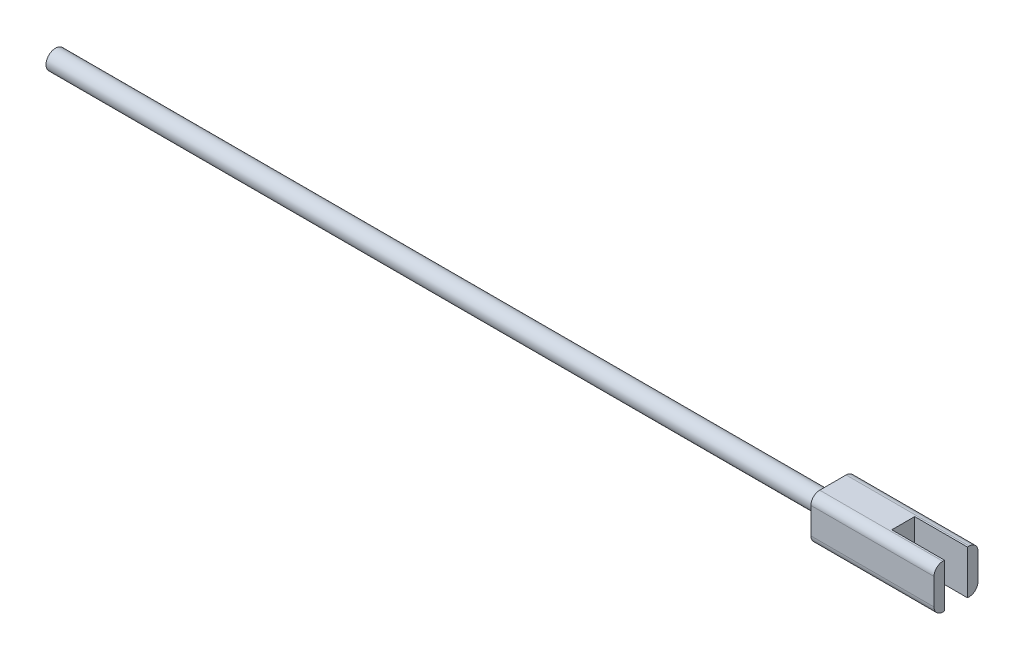
ISO-10303-21;
HEADER;
FILE_DESCRIPTION(('STEP AP214'),'2;1');
FILE_NAME('part.step','',(''),(''),'','','');
FILE_SCHEMA(('AUTOMOTIVE_DESIGN { 1 0 10303 214 1 1 1 1 }'));
ENDSEC;
DATA;
#1=APPLICATION_CONTEXT('core data for automotive mechanical design processes');
#2=APPLICATION_PROTOCOL_DEFINITION('international standard','automotive_design',2000,#1);
#3=PRODUCT_CONTEXT('',#1,'mechanical');
#4=PRODUCT('Part','Part','',(#3));
#5=PRODUCT_RELATED_PRODUCT_CATEGORY('part','',(#4));
#6=PRODUCT_DEFINITION_FORMATION('','',#4);
#7=PRODUCT_DEFINITION_CONTEXT('part definition',#1,'design');
#8=PRODUCT_DEFINITION('design','',#6,#7);
#9=PRODUCT_DEFINITION_SHAPE('','',#8);
#10=(LENGTH_UNIT() NAMED_UNIT(*) SI_UNIT(.MILLI.,.METRE.));
#11=(NAMED_UNIT(*) PLANE_ANGLE_UNIT() SI_UNIT($,.RADIAN.));
#12=(NAMED_UNIT(*) SI_UNIT($,.STERADIAN.) SOLID_ANGLE_UNIT());
#13=UNCERTAINTY_MEASURE_WITH_UNIT(LENGTH_MEASURE(1.E-05),#10,'distance_accuracy_value','');
#14=(GEOMETRIC_REPRESENTATION_CONTEXT(3) GLOBAL_UNCERTAINTY_ASSIGNED_CONTEXT((#13)) GLOBAL_UNIT_ASSIGNED_CONTEXT((#10,
#11,#12)) REPRESENTATION_CONTEXT('',''));
#15=CARTESIAN_POINT('',(0.,0.,0.));
#16=DIRECTION('',(0.,0.,1.));
#17=DIRECTION('',(1.,0.,0.));
#18=AXIS2_PLACEMENT_3D('',#15,#16,#17);
#19=CARTESIAN_POINT('',(102.392,-1.5,1.5));
#20=DIRECTION('',(1.,0.,0.));
#21=DIRECTION('',(0.,0.,-1.));
#22=AXIS2_PLACEMENT_3D('',#19,#20,#21);
#23=PLANE('',#22);
#24=DIRECTION('',(0.,1.,0.));
#25=VECTOR('',#24,1.);
#26=CARTESIAN_POINT('',(102.392,-1.5,-1.3));
#27=LINE('',#26,#25);
#28=CARTESIAN_POINT('',(102.392,-2.5,-1.3));
#29=VERTEX_POINT('',#28);
#30=CARTESIAN_POINT('',(102.392,2.5,-1.3));
#31=VERTEX_POINT('',#30);
#32=EDGE_CURVE('E11',#29,#31,#27,.T.);
#33=ORIENTED_EDGE('',*,*,#32,.F.);
#34=DIRECTION('',(0.,0.,-1.));
#35=VECTOR('',#34,1.);
#36=CARTESIAN_POINT('',(102.392,-2.5,1.5));
#37=LINE('',#36,#35);
#38=CARTESIAN_POINT('',(102.392,-2.5,-1.5));
#39=VERTEX_POINT('',#38);
#40=EDGE_CURVE('E202',#29,#39,#37,.T.);
#41=ORIENTED_EDGE('',*,*,#40,.T.);
#42=CARTESIAN_POINT('',(102.392,-1.5,-1.5));
#43=DIRECTION('',(1.,0.,0.));
#44=DIRECTION('',(0.,0.,-1.));
#45=AXIS2_PLACEMENT_3D('',#42,#43,#44);
#46=CIRCLE('',#45,1.);
#47=CARTESIAN_POINT('',(102.392,-1.5,-2.5));
#48=VERTEX_POINT('',#47);
#49=EDGE_CURVE('E201',#39,#48,#46,.T.);
#50=ORIENTED_EDGE('',*,*,#49,.T.);
#51=DIRECTION('',(0.,1.,0.));
#52=VECTOR('',#51,1.);
#53=CARTESIAN_POINT('',(102.392,-1.5,-2.5));
#54=LINE('',#53,#52);
#55=CARTESIAN_POINT('',(102.392,1.5,-2.5));
#56=VERTEX_POINT('',#55);
#57=EDGE_CURVE('E204',#48,#56,#54,.T.);
#58=ORIENTED_EDGE('',*,*,#57,.T.);
#59=CARTESIAN_POINT('',(102.392,1.5,-1.5));
#60=DIRECTION('',(1.,0.,0.));
#61=DIRECTION('',(0.,0.,-1.));
#62=AXIS2_PLACEMENT_3D('',#59,#60,#61);
#63=CIRCLE('',#62,1.);
#64=CARTESIAN_POINT('',(102.392,2.5,-1.5));
#65=VERTEX_POINT('',#64);
#66=EDGE_CURVE('E129',#56,#65,#63,.T.);
#67=ORIENTED_EDGE('',*,*,#66,.T.);
#68=DIRECTION('',(0.,0.,1.));
#69=VECTOR('',#68,1.);
#70=CARTESIAN_POINT('',(102.392,2.5,-1.5));
#71=LINE('',#70,#69);
#72=EDGE_CURVE('E128',#65,#31,#71,.T.);
#73=ORIENTED_EDGE('',*,*,#72,.T.);
#74=EDGE_LOOP('',(#33,#41,#50,#58,#67,#73));
#75=FACE_BOUND('',#74,.T.);
#76=ADVANCED_FACE('F39',(#75),#23,.T.);
#77=CARTESIAN_POINT('',(90.392,0.,0.));
#78=DIRECTION('',(-1.,0.,0.));
#79=DIRECTION('',(0.,0.,1.));
#80=AXIS2_PLACEMENT_3D('',#77,#78,#79);
#81=CYLINDRICAL_SURFACE('',#80,1.09);
#82=CARTESIAN_POINT('',(0.,0.,0.));
#83=DIRECTION('',(1.,0.,0.));
#84=DIRECTION('',(0.,0.,-1.));
#85=AXIS2_PLACEMENT_3D('',#82,#83,#84);
#86=CIRCLE('',#85,1.09);
#87=CARTESIAN_POINT('',(0.,0.,-1.09));
#88=VERTEX_POINT('',#87);
#89=EDGE_CURVE('E181',#88,#88,#86,.T.);
#90=ORIENTED_EDGE('',*,*,#89,.T.);
#91=EDGE_LOOP('',(#90));
#92=FACE_BOUND('',#91,.T.);
#93=CARTESIAN_POINT('',(88.392,0.,0.));
#94=DIRECTION('',(1.,0.,0.));
#95=DIRECTION('',(0.,0.,-1.));
#96=AXIS2_PLACEMENT_3D('',#93,#94,#95);
#97=CIRCLE('',#96,1.09);
#98=CARTESIAN_POINT('',(88.392,0.,-1.09));
#99=VERTEX_POINT('',#98);
#100=EDGE_CURVE('E184',#99,#99,#97,.T.);
#101=ORIENTED_EDGE('',*,*,#100,.F.);
#102=EDGE_LOOP('',(#101));
#103=FACE_BOUND('',#102,.T.);
#104=ADVANCED_FACE('F41',(#92,#103),#81,.T.);
#105=CARTESIAN_POINT('',(0.,0.,0.));
#106=DIRECTION('',(1.,0.,0.));
#107=DIRECTION('',(0.,0.,-1.));
#108=AXIS2_PLACEMENT_3D('',#105,#106,#107);
#109=PLANE('',#108);
#110=ORIENTED_EDGE('',*,*,#89,.F.);
#111=EDGE_LOOP('',(#110));
#112=FACE_BOUND('',#111,.T.);
#113=ADVANCED_FACE('F264',(#112),#109,.F.);
#114=CARTESIAN_POINT('',(102.392,-1.5,1.5));
#115=DIRECTION('',(-1.,0.,0.));
#116=DIRECTION('',(0.,0.,1.));
#117=AXIS2_PLACEMENT_3D('',#114,#115,#116);
#118=CYLINDRICAL_SURFACE('',#117,1.);
#119=CARTESIAN_POINT('',(88.392,-1.5,1.5));
#120=DIRECTION('',(1.,0.,0.));
#121=DIRECTION('',(0.,0.,-1.));
#122=AXIS2_PLACEMENT_3D('',#119,#120,#121);
#123=CIRCLE('',#122,1.);
#124=CARTESIAN_POINT('',(88.392,-1.5,2.5));
#125=VERTEX_POINT('',#124);
#126=CARTESIAN_POINT('',(88.392,-2.5,1.5));
#127=VERTEX_POINT('',#126);
#128=EDGE_CURVE('E150',#125,#127,#123,.T.);
#129=ORIENTED_EDGE('',*,*,#128,.T.);
#130=DIRECTION('',(-1.,0.,0.));
#131=VECTOR('',#130,1.);
#132=CARTESIAN_POINT('',(102.392,-2.5,1.5));
#133=LINE('',#132,#131);
#134=CARTESIAN_POINT('',(102.392,-2.5,1.5));
#135=VERTEX_POINT('',#134);
#136=EDGE_CURVE('E179',#135,#127,#133,.T.);
#137=ORIENTED_EDGE('',*,*,#136,.F.);
#138=CARTESIAN_POINT('',(102.392,-1.5,1.5));
#139=DIRECTION('',(1.,0.,0.));
#140=DIRECTION('',(0.,0.,-1.));
#141=AXIS2_PLACEMENT_3D('',#138,#139,#140);
#142=CIRCLE('',#141,1.);
#143=CARTESIAN_POINT('',(102.392,-1.5,2.5));
#144=VERTEX_POINT('',#143);
#145=EDGE_CURVE('E166',#144,#135,#142,.T.);
#146=ORIENTED_EDGE('',*,*,#145,.F.);
#147=DIRECTION('',(-1.,0.,0.));
#148=VECTOR('',#147,1.);
#149=CARTESIAN_POINT('',(102.392,-1.5,2.5));
#150=LINE('',#149,#148);
#151=EDGE_CURVE('E145',#144,#125,#150,.T.);
#152=ORIENTED_EDGE('',*,*,#151,.T.);
#153=EDGE_LOOP('',(#129,#137,#146,#152));
#154=FACE_BOUND('',#153,.T.);
#155=ADVANCED_FACE('F262',(#154),#118,.T.);
#156=CARTESIAN_POINT('',(102.392,-2.5,1.5));
#157=DIRECTION('',(0.,1.,0.));
#158=DIRECTION('',(0.,0.,1.));
#159=AXIS2_PLACEMENT_3D('',#156,#157,#158);
#160=PLANE('',#159);
#161=ORIENTED_EDGE('',*,*,#40,.F.);
#162=DIRECTION('',(-1.,0.,0.));
#163=VECTOR('',#162,1.);
#164=CARTESIAN_POINT('',(96.392,-2.5,-1.3));
#165=LINE('',#164,#163);
#166=CARTESIAN_POINT('',(96.392,-2.5,-1.3));
#167=VERTEX_POINT('',#166);
#168=EDGE_CURVE('E197',#29,#167,#165,.T.);
#169=ORIENTED_EDGE('',*,*,#168,.T.);
#170=DIRECTION('',(0.,0.,1.));
#171=VECTOR('',#170,1.);
#172=CARTESIAN_POINT('',(96.392,-2.5,1.3));
#173=LINE('',#172,#171);
#174=CARTESIAN_POINT('',(96.392,-2.5,1.3));
#175=VERTEX_POINT('',#174);
#176=EDGE_CURVE('E196',#167,#175,#173,.T.);
#177=ORIENTED_EDGE('',*,*,#176,.T.);
#178=DIRECTION('',(1.,0.,0.));
#179=VECTOR('',#178,1.);
#180=CARTESIAN_POINT('',(103.392,-2.5,1.3));
#181=LINE('',#180,#179);
#182=CARTESIAN_POINT('',(102.392,-2.5,1.3));
#183=VERTEX_POINT('',#182);
#184=EDGE_CURVE('E189',#175,#183,#181,.T.);
#185=ORIENTED_EDGE('',*,*,#184,.T.);
#186=EDGE_CURVE('E105',#135,#183,#37,.T.);
#187=ORIENTED_EDGE('',*,*,#186,.F.);
#188=ORIENTED_EDGE('',*,*,#136,.T.);
#189=DIRECTION('',(0.,0.,-1.));
#190=VECTOR('',#189,1.);
#191=CARTESIAN_POINT('',(88.392,-2.5,1.5));
#192=LINE('',#191,#190);
#193=CARTESIAN_POINT('',(88.392,-2.5,-1.5));
#194=VERTEX_POINT('',#193);
#195=EDGE_CURVE('E153',#127,#194,#192,.T.);
#196=ORIENTED_EDGE('',*,*,#195,.T.);
#197=DIRECTION('',(-1.,0.,0.));
#198=VECTOR('',#197,1.);
#199=CARTESIAN_POINT('',(102.392,-2.5,-1.5));
#200=LINE('',#199,#198);
#201=EDGE_CURVE('E176',#39,#194,#200,.T.);
#202=ORIENTED_EDGE('',*,*,#201,.F.);
#203=EDGE_LOOP('',(#161,#169,#177,#185,#187,#188,#196,#202));
#204=FACE_BOUND('',#203,.T.);
#205=ADVANCED_FACE('F193',(#204),#160,.F.);
#206=CARTESIAN_POINT('',(102.392,-1.5,-1.5));
#207=DIRECTION('',(-1.,0.,0.));
#208=DIRECTION('',(0.,0.,1.));
#209=AXIS2_PLACEMENT_3D('',#206,#207,#208);
#210=CYLINDRICAL_SURFACE('',#209,1.);
#211=CARTESIAN_POINT('',(88.392,-1.5,-1.5));
#212=DIRECTION('',(1.,0.,0.));
#213=DIRECTION('',(0.,0.,-1.));
#214=AXIS2_PLACEMENT_3D('',#211,#212,#213);
#215=CIRCLE('',#214,1.);
#216=CARTESIAN_POINT('',(88.392,-1.5,-2.5));
#217=VERTEX_POINT('',#216);
#218=EDGE_CURVE('E156',#194,#217,#215,.T.);
#219=ORIENTED_EDGE('',*,*,#218,.T.);
#220=DIRECTION('',(-1.,0.,0.));
#221=VECTOR('',#220,1.);
#222=CARTESIAN_POINT('',(102.392,-1.5,-2.5));
#223=LINE('',#222,#221);
#224=EDGE_CURVE('E173',#48,#217,#223,.T.);
#225=ORIENTED_EDGE('',*,*,#224,.F.);
#226=ORIENTED_EDGE('',*,*,#49,.F.);
#227=ORIENTED_EDGE('',*,*,#201,.T.);
#228=EDGE_LOOP('',(#219,#225,#226,#227));
#229=FACE_BOUND('',#228,.T.);
#230=ADVANCED_FACE('F253',(#229),#210,.T.);
#231=CARTESIAN_POINT('',(102.392,-1.5,-2.5));
#232=DIRECTION('',(0.,0.,1.));
#233=DIRECTION('',(1.,0.,0.));
#234=AXIS2_PLACEMENT_3D('',#231,#232,#233);
#235=PLANE('',#234);
#236=DIRECTION('',(0.,1.,0.));
#237=VECTOR('',#236,1.);
#238=CARTESIAN_POINT('',(88.392,-1.5,-2.5));
#239=LINE('',#238,#237);
#240=CARTESIAN_POINT('',(88.392,1.5,-2.5));
#241=VERTEX_POINT('',#240);
#242=EDGE_CURVE('E158',#217,#241,#239,.T.);
#243=ORIENTED_EDGE('',*,*,#242,.T.);
#244=DIRECTION('',(-1.,0.,0.));
#245=VECTOR('',#244,1.);
#246=CARTESIAN_POINT('',(102.392,1.5,-2.5));
#247=LINE('',#246,#245);
#248=EDGE_CURVE('E170',#56,#241,#247,.T.);
#249=ORIENTED_EDGE('',*,*,#248,.F.);
#250=ORIENTED_EDGE('',*,*,#57,.F.);
#251=ORIENTED_EDGE('',*,*,#224,.T.);
#252=EDGE_LOOP('',(#243,#249,#250,#251));
#253=FACE_BOUND('',#252,.T.);
#254=ADVANCED_FACE('F256',(#253),#235,.F.);
#255=CARTESIAN_POINT('',(102.392,1.5,-1.5));
#256=DIRECTION('',(-1.,0.,0.));
#257=DIRECTION('',(0.,0.,1.));
#258=AXIS2_PLACEMENT_3D('',#255,#256,#257);
#259=CYLINDRICAL_SURFACE('',#258,1.);
#260=CARTESIAN_POINT('',(88.392,1.5,-1.5));
#261=DIRECTION('',(1.,0.,0.));
#262=DIRECTION('',(0.,0.,-1.));
#263=AXIS2_PLACEMENT_3D('',#260,#261,#262);
#264=CIRCLE('',#263,1.);
#265=CARTESIAN_POINT('',(88.392,2.5,-1.5));
#266=VERTEX_POINT('',#265);
#267=EDGE_CURVE('E160',#241,#266,#264,.T.);
#268=ORIENTED_EDGE('',*,*,#267,.T.);
#269=DIRECTION('',(-1.,0.,0.));
#270=VECTOR('',#269,1.);
#271=CARTESIAN_POINT('',(102.392,2.5,-1.5));
#272=LINE('',#271,#270);
#273=EDGE_CURVE('E140',#65,#266,#272,.T.);
#274=ORIENTED_EDGE('',*,*,#273,.F.);
#275=ORIENTED_EDGE('',*,*,#66,.F.);
#276=ORIENTED_EDGE('',*,*,#248,.T.);
#277=EDGE_LOOP('',(#268,#274,#275,#276));
#278=FACE_BOUND('',#277,.T.);
#279=ADVANCED_FACE('F218',(#278),#259,.T.);
#280=CARTESIAN_POINT('',(102.392,2.5,-1.5));
#281=DIRECTION('',(0.,-1.,0.));
#282=DIRECTION('',(0.,0.,-1.));
#283=AXIS2_PLACEMENT_3D('',#280,#281,#282);
#284=PLANE('',#283);
#285=DIRECTION('',(0.,0.,1.));
#286=VECTOR('',#285,1.);
#287=CARTESIAN_POINT('',(96.392,2.5,1.3));
#288=LINE('',#287,#286);
#289=CARTESIAN_POINT('',(96.392,2.5,-1.3));
#290=VERTEX_POINT('',#289);
#291=CARTESIAN_POINT('',(96.392,2.5,1.3));
#292=VERTEX_POINT('',#291);
#293=EDGE_CURVE('E225',#290,#292,#288,.T.);
#294=ORIENTED_EDGE('',*,*,#293,.F.);
#295=DIRECTION('',(-1.,0.,0.));
#296=VECTOR('',#295,1.);
#297=CARTESIAN_POINT('',(96.392,2.5,-1.3));
#298=LINE('',#297,#296);
#299=EDGE_CURVE('E222',#31,#290,#298,.T.);
#300=ORIENTED_EDGE('',*,*,#299,.F.);
#301=ORIENTED_EDGE('',*,*,#72,.F.);
#302=ORIENTED_EDGE('',*,*,#273,.T.);
#303=DIRECTION('',(0.,0.,1.));
#304=VECTOR('',#303,1.);
#305=CARTESIAN_POINT('',(88.392,2.5,-1.5));
#306=LINE('',#305,#304);
#307=CARTESIAN_POINT('',(88.392,2.5,1.5));
#308=VERTEX_POINT('',#307);
#309=EDGE_CURVE('E137',#266,#308,#306,.T.);
#310=ORIENTED_EDGE('',*,*,#309,.T.);
#311=DIRECTION('',(-1.,0.,0.));
#312=VECTOR('',#311,1.);
#313=CARTESIAN_POINT('',(102.392,2.5,1.5));
#314=LINE('',#313,#312);
#315=CARTESIAN_POINT('',(102.392,2.5,1.5));
#316=VERTEX_POINT('',#315);
#317=EDGE_CURVE('E132',#316,#308,#314,.T.);
#318=ORIENTED_EDGE('',*,*,#317,.F.);
#319=CARTESIAN_POINT('',(102.392,2.5,1.3));
#320=VERTEX_POINT('',#319);
#321=EDGE_CURVE('E121',#320,#316,#71,.T.);
#322=ORIENTED_EDGE('',*,*,#321,.F.);
#323=DIRECTION('',(1.,0.,0.));
#324=VECTOR('',#323,1.);
#325=CARTESIAN_POINT('',(103.392,2.5,1.3));
#326=LINE('',#325,#324);
#327=EDGE_CURVE('E54',#292,#320,#326,.T.);
#328=ORIENTED_EDGE('',*,*,#327,.F.);
#329=EDGE_LOOP('',(#294,#300,#301,#302,#310,#318,#322,#328));
#330=FACE_BOUND('',#329,.T.);
#331=ADVANCED_FACE('F134',(#330),#284,.F.);
#332=CARTESIAN_POINT('',(102.392,1.5,1.5));
#333=DIRECTION('',(-1.,0.,0.));
#334=DIRECTION('',(0.,0.,1.));
#335=AXIS2_PLACEMENT_3D('',#332,#333,#334);
#336=CYLINDRICAL_SURFACE('',#335,1.);
#337=CARTESIAN_POINT('',(88.392,1.5,1.5));
#338=DIRECTION('',(1.,0.,0.));
#339=DIRECTION('',(0.,0.,-1.));
#340=AXIS2_PLACEMENT_3D('',#337,#338,#339);
#341=CIRCLE('',#340,1.);
#342=CARTESIAN_POINT('',(88.392,1.5,2.5));
#343=VERTEX_POINT('',#342);
#344=EDGE_CURVE('E163',#308,#343,#341,.T.);
#345=ORIENTED_EDGE('',*,*,#344,.T.);
#346=DIRECTION('',(-1.,0.,0.));
#347=VECTOR('',#346,1.);
#348=CARTESIAN_POINT('',(102.392,1.5,2.5));
#349=LINE('',#348,#347);
#350=CARTESIAN_POINT('',(102.392,1.5,2.5));
#351=VERTEX_POINT('',#350);
#352=EDGE_CURVE('E141',#351,#343,#349,.T.);
#353=ORIENTED_EDGE('',*,*,#352,.F.);
#354=CARTESIAN_POINT('',(102.392,1.5,1.5));
#355=DIRECTION('',(1.,0.,0.));
#356=DIRECTION('',(0.,0.,-1.));
#357=AXIS2_PLACEMENT_3D('',#354,#355,#356);
#358=CIRCLE('',#357,1.);
#359=EDGE_CURVE('E125',#316,#351,#358,.T.);
#360=ORIENTED_EDGE('',*,*,#359,.F.);
#361=ORIENTED_EDGE('',*,*,#317,.T.);
#362=EDGE_LOOP('',(#345,#353,#360,#361));
#363=FACE_BOUND('',#362,.T.);
#364=ADVANCED_FACE('F143',(#363),#336,.T.);
#365=CARTESIAN_POINT('',(102.392,1.5,2.5));
#366=DIRECTION('',(0.,0.,-1.));
#367=DIRECTION('',(-1.,0.,0.));
#368=AXIS2_PLACEMENT_3D('',#365,#366,#367);
#369=PLANE('',#368);
#370=DIRECTION('',(0.,-1.,0.));
#371=VECTOR('',#370,1.);
#372=CARTESIAN_POINT('',(88.392,1.5,2.5));
#373=LINE('',#372,#371);
#374=EDGE_CURVE('E96',#343,#125,#373,.T.);
#375=ORIENTED_EDGE('',*,*,#374,.T.);
#376=ORIENTED_EDGE('',*,*,#151,.F.);
#377=DIRECTION('',(0.,-1.,0.));
#378=VECTOR('',#377,1.);
#379=CARTESIAN_POINT('',(102.392,1.5,2.5));
#380=LINE('',#379,#378);
#381=EDGE_CURVE('E63',#351,#144,#380,.T.);
#382=ORIENTED_EDGE('',*,*,#381,.F.);
#383=ORIENTED_EDGE('',*,*,#352,.T.);
#384=EDGE_LOOP('',(#375,#376,#382,#383));
#385=FACE_BOUND('',#384,.T.);
#386=ADVANCED_FACE('F260',(#385),#369,.F.);
#387=DIRECTION('',(0.,-1.,0.));
#388=VECTOR('',#387,1.);
#389=CARTESIAN_POINT('',(102.392,-1.5,1.3));
#390=LINE('',#389,#388);
#391=EDGE_CURVE('E47',#320,#183,#390,.T.);
#392=ORIENTED_EDGE('',*,*,#391,.F.);
#393=ORIENTED_EDGE('',*,*,#321,.T.);
#394=ORIENTED_EDGE('',*,*,#359,.T.);
#395=ORIENTED_EDGE('',*,*,#381,.T.);
#396=ORIENTED_EDGE('',*,*,#145,.T.);
#397=ORIENTED_EDGE('',*,*,#186,.T.);
#398=EDGE_LOOP('',(#392,#393,#394,#395,#396,#397));
#399=FACE_BOUND('',#398,.T.);
#400=ADVANCED_FACE('F123',(#399),#23,.T.);
#401=CARTESIAN_POINT('',(88.392,-1.5,1.5));
#402=DIRECTION('',(1.,0.,0.));
#403=DIRECTION('',(0.,0.,-1.));
#404=AXIS2_PLACEMENT_3D('',#401,#402,#403);
#405=PLANE('',#404);
#406=ORIENTED_EDGE('',*,*,#100,.T.);
#407=EDGE_LOOP('',(#406));
#408=FACE_BOUND('',#407,.T.);
#409=ORIENTED_EDGE('',*,*,#128,.F.);
#410=ORIENTED_EDGE('',*,*,#374,.F.);
#411=ORIENTED_EDGE('',*,*,#344,.F.);
#412=ORIENTED_EDGE('',*,*,#309,.F.);
#413=ORIENTED_EDGE('',*,*,#267,.F.);
#414=ORIENTED_EDGE('',*,*,#242,.F.);
#415=ORIENTED_EDGE('',*,*,#218,.F.);
#416=ORIENTED_EDGE('',*,*,#195,.F.);
#417=EDGE_LOOP('',(#409,#410,#411,#412,#413,#414,#415,#416));
#418=FACE_BOUND('',#417,.T.);
#419=ADVANCED_FACE('F259',(#408,#418),#405,.F.);
#420=CARTESIAN_POINT('',(96.392,-2.5,1.3));
#421=DIRECTION('',(-1.,0.,0.));
#422=DIRECTION('',(0.,0.,1.));
#423=AXIS2_PLACEMENT_3D('',#420,#421,#422);
#424=PLANE('',#423);
#425=DIRECTION('',(0.,1.,0.));
#426=VECTOR('',#425,1.);
#427=CARTESIAN_POINT('',(96.392,-2.5,1.3));
#428=LINE('',#427,#426);
#429=EDGE_CURVE('E237',#175,#292,#428,.T.);
#430=ORIENTED_EDGE('',*,*,#429,.F.);
#431=ORIENTED_EDGE('',*,*,#176,.F.);
#432=DIRECTION('',(0.,1.,0.));
#433=VECTOR('',#432,1.);
#434=CARTESIAN_POINT('',(96.392,-2.5,-1.3));
#435=LINE('',#434,#433);
#436=EDGE_CURVE('E154',#167,#290,#435,.T.);
#437=ORIENTED_EDGE('',*,*,#436,.T.);
#438=ORIENTED_EDGE('',*,*,#293,.T.);
#439=EDGE_LOOP('',(#430,#431,#437,#438));
#440=FACE_BOUND('',#439,.T.);
#441=ADVANCED_FACE('F242',(#440),#424,.F.);
#442=CARTESIAN_POINT('',(96.392,-2.5,-1.3));
#443=DIRECTION('',(0.,0.,-1.));
#444=DIRECTION('',(-1.,0.,0.));
#445=AXIS2_PLACEMENT_3D('',#442,#443,#444);
#446=PLANE('',#445);
#447=ORIENTED_EDGE('',*,*,#32,.T.);
#448=ORIENTED_EDGE('',*,*,#299,.T.);
#449=ORIENTED_EDGE('',*,*,#436,.F.);
#450=ORIENTED_EDGE('',*,*,#168,.F.);
#451=EDGE_LOOP('',(#447,#448,#449,#450));
#452=FACE_BOUND('',#451,.T.);
#453=ADVANCED_FACE('F245',(#452),#446,.F.);
#454=CARTESIAN_POINT('',(103.392,-2.5,1.3));
#455=DIRECTION('',(0.,0.,1.));
#456=DIRECTION('',(1.,0.,0.));
#457=AXIS2_PLACEMENT_3D('',#454,#455,#456);
#458=PLANE('',#457);
#459=ORIENTED_EDGE('',*,*,#391,.T.);
#460=ORIENTED_EDGE('',*,*,#184,.F.);
#461=ORIENTED_EDGE('',*,*,#429,.T.);
#462=ORIENTED_EDGE('',*,*,#327,.T.);
#463=EDGE_LOOP('',(#459,#460,#461,#462));
#464=FACE_BOUND('',#463,.T.);
#465=ADVANCED_FACE('F187',(#464),#458,.F.);
#466=CLOSED_SHELL('',(#76,#104,#113,#155,#205,#230,#254,#279,#331,#364,#386,#400,#419,#441,#453,#465));
#467=MANIFOLD_SOLID_BREP('B2',#466);
#468=ADVANCED_BREP_SHAPE_REPRESENTATION('',(#18,#467),#14);
#469=SHAPE_DEFINITION_REPRESENTATION(#9,#468);
ENDSEC;
END-ISO-10303-21;
